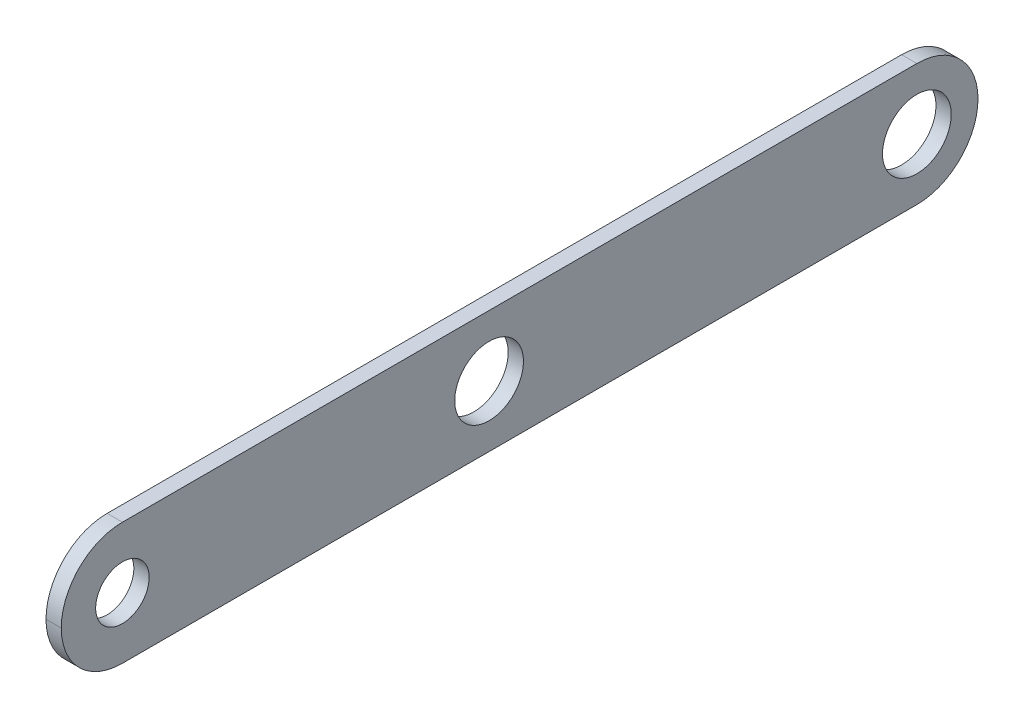
ISO-10303-21;
HEADER;
FILE_DESCRIPTION(('STEP AP214'),'2;1');
FILE_NAME('part.step','',(''),(''),'','','');
FILE_SCHEMA(('AUTOMOTIVE_DESIGN { 1 0 10303 214 1 1 1 1 }'));
ENDSEC;
DATA;
#1=APPLICATION_CONTEXT('core data for automotive mechanical design processes');
#2=APPLICATION_PROTOCOL_DEFINITION('international standard','automotive_design',2000,#1);
#3=PRODUCT_CONTEXT('',#1,'mechanical');
#4=PRODUCT('Part','Part','',(#3));
#5=PRODUCT_RELATED_PRODUCT_CATEGORY('part','',(#4));
#6=PRODUCT_DEFINITION_FORMATION('','',#4);
#7=PRODUCT_DEFINITION_CONTEXT('part definition',#1,'design');
#8=PRODUCT_DEFINITION('design','',#6,#7);
#9=PRODUCT_DEFINITION_SHAPE('','',#8);
#10=(LENGTH_UNIT() NAMED_UNIT(*) SI_UNIT(.MILLI.,.METRE.));
#11=(NAMED_UNIT(*) PLANE_ANGLE_UNIT() SI_UNIT($,.RADIAN.));
#12=(NAMED_UNIT(*) SI_UNIT($,.STERADIAN.) SOLID_ANGLE_UNIT());
#13=UNCERTAINTY_MEASURE_WITH_UNIT(LENGTH_MEASURE(1.E-05),#10,'distance_accuracy_value','');
#14=(GEOMETRIC_REPRESENTATION_CONTEXT(3) GLOBAL_UNCERTAINTY_ASSIGNED_CONTEXT((#13)) GLOBAL_UNIT_ASSIGNED_CONTEXT((#10,
#11,#12)) REPRESENTATION_CONTEXT('',''));
#15=CARTESIAN_POINT('',(0.,0.,0.));
#16=DIRECTION('',(0.,0.,1.));
#17=DIRECTION('',(1.,0.,0.));
#18=AXIS2_PLACEMENT_3D('',#15,#16,#17);
#19=CARTESIAN_POINT('',(6.35,0.,0.));
#20=DIRECTION('',(-1.,0.,0.));
#21=DIRECTION('',(0.,0.,1.));
#22=AXIS2_PLACEMENT_3D('',#19,#20,#21);
#23=PLANE('',#22);
#24=CARTESIAN_POINT('',(6.35,25.4,-25.4));
#25=DIRECTION('',(-1.,0.,0.));
#26=DIRECTION('',(0.,0.,1.));
#27=AXIS2_PLACEMENT_3D('',#24,#25,#26);
#28=CIRCLE('',#27,25.4);
#29=CARTESIAN_POINT('',(6.35,50.8,-25.4));
#30=VERTEX_POINT('',#29);
#31=CARTESIAN_POINT('',(6.35,25.4,0.));
#32=VERTEX_POINT('',#31);
#33=EDGE_CURVE('E151',#30,#32,#28,.F.);
#34=ORIENTED_EDGE('',*,*,#33,.T.);
#35=CARTESIAN_POINT('',(6.35,25.4,-25.4));
#36=DIRECTION('',(-1.,0.,0.));
#37=DIRECTION('',(0.,0.,1.));
#38=AXIS2_PLACEMENT_3D('',#35,#36,#37);
#39=CIRCLE('',#38,25.4);
#40=CARTESIAN_POINT('',(6.35,0.,-25.4));
#41=VERTEX_POINT('',#40);
#42=EDGE_CURVE('E154',#32,#41,#39,.F.);
#43=ORIENTED_EDGE('',*,*,#42,.T.);
#44=DIRECTION('',(0.,0.,-1.));
#45=VECTOR('',#44,1.);
#46=CARTESIAN_POINT('',(6.35,0.,0.));
#47=LINE('',#46,#45);
#48=CARTESIAN_POINT('',(6.35,0.,-355.6));
#49=VERTEX_POINT('',#48);
#50=EDGE_CURVE('E115',#41,#49,#47,.T.);
#51=ORIENTED_EDGE('',*,*,#50,.T.);
#52=CARTESIAN_POINT('',(6.35,25.4,-355.6));
#53=DIRECTION('',(-1.,0.,0.));
#54=DIRECTION('',(0.,0.,1.));
#55=AXIS2_PLACEMENT_3D('',#52,#53,#54);
#56=CIRCLE('',#55,25.4);
#57=CARTESIAN_POINT('',(6.35,25.4,-381.));
#58=VERTEX_POINT('',#57);
#59=EDGE_CURVE('E148',#49,#58,#56,.F.);
#60=ORIENTED_EDGE('',*,*,#59,.T.);
#61=CARTESIAN_POINT('',(6.35,25.4,-355.6));
#62=DIRECTION('',(-1.,0.,0.));
#63=DIRECTION('',(0.,0.,1.));
#64=AXIS2_PLACEMENT_3D('',#61,#62,#63);
#65=CIRCLE('',#64,25.4);
#66=CARTESIAN_POINT('',(6.35,50.8,-355.6));
#67=VERTEX_POINT('',#66);
#68=EDGE_CURVE('E62',#58,#67,#65,.F.);
#69=ORIENTED_EDGE('',*,*,#68,.T.);
#70=DIRECTION('',(0.,0.,1.));
#71=VECTOR('',#70,1.);
#72=CARTESIAN_POINT('',(6.35,50.8,0.));
#73=LINE('',#72,#71);
#74=EDGE_CURVE('E135',#67,#30,#73,.T.);
#75=ORIENTED_EDGE('',*,*,#74,.T.);
#76=EDGE_LOOP('',(#34,#43,#51,#60,#69,#75));
#77=FACE_BOUND('',#76,.T.);
#78=CARTESIAN_POINT('',(6.35,25.4,-25.4));
#79=DIRECTION('',(1.,0.,0.));
#80=DIRECTION('',(0.,0.,-1.));
#81=AXIS2_PLACEMENT_3D('',#78,#79,#80);
#82=CIRCLE('',#81,11.1125);
#83=CARTESIAN_POINT('',(6.35,25.4,-36.5125));
#84=VERTEX_POINT('',#83);
#85=EDGE_CURVE('E126',#84,#84,#82,.T.);
#86=ORIENTED_EDGE('',*,*,#85,.F.);
#87=EDGE_LOOP('',(#86));
#88=FACE_BOUND('',#87,.T.);
#89=CARTESIAN_POINT('',(6.35,25.4,-177.8));
#90=DIRECTION('',(1.,0.,0.));
#91=DIRECTION('',(0.,0.,-1.));
#92=AXIS2_PLACEMENT_3D('',#89,#90,#91);
#93=CIRCLE('',#92,14.2875);
#94=CARTESIAN_POINT('',(6.35,25.4,-192.0875));
#95=VERTEX_POINT('',#94);
#96=EDGE_CURVE('E183',#95,#95,#93,.T.);
#97=ORIENTED_EDGE('',*,*,#96,.F.);
#98=EDGE_LOOP('',(#97));
#99=FACE_BOUND('',#98,.T.);
#100=CARTESIAN_POINT('',(6.35,25.4,-355.6));
#101=DIRECTION('',(1.,0.,0.));
#102=DIRECTION('',(0.,0.,1.));
#103=AXIS2_PLACEMENT_3D('',#100,#101,#102);
#104=CIRCLE('',#103,14.2875);
#105=CARTESIAN_POINT('',(6.35,25.4,-341.3125));
#106=VERTEX_POINT('',#105);
#107=EDGE_CURVE('E163',#106,#106,#104,.T.);
#108=ORIENTED_EDGE('',*,*,#107,.F.);
#109=EDGE_LOOP('',(#108));
#110=FACE_BOUND('',#109,.T.);
#111=ADVANCED_FACE('F39',(#77,#88,#99,#110),#23,.F.);
#112=CARTESIAN_POINT('',(0.,0.,0.));
#113=DIRECTION('',(-1.,0.,0.));
#114=DIRECTION('',(0.,0.,1.));
#115=AXIS2_PLACEMENT_3D('',#112,#113,#114);
#116=PLANE('',#115);
#117=CARTESIAN_POINT('',(0.,25.4,-177.8));
#118=DIRECTION('',(1.,0.,0.));
#119=DIRECTION('',(0.,0.,-1.));
#120=AXIS2_PLACEMENT_3D('',#117,#118,#119);
#121=CIRCLE('',#120,14.2875);
#122=CARTESIAN_POINT('',(0.,25.4,-192.0875));
#123=VERTEX_POINT('',#122);
#124=EDGE_CURVE('E185',#123,#123,#121,.T.);
#125=ORIENTED_EDGE('',*,*,#124,.T.);
#126=EDGE_LOOP('',(#125));
#127=FACE_BOUND('',#126,.T.);
#128=DIRECTION('',(0.,0.,-1.));
#129=VECTOR('',#128,1.);
#130=CARTESIAN_POINT('',(0.,0.,0.));
#131=LINE('',#130,#129);
#132=CARTESIAN_POINT('',(0.,0.,-25.4));
#133=VERTEX_POINT('',#132);
#134=CARTESIAN_POINT('',(0.,0.,-355.6));
#135=VERTEX_POINT('',#134);
#136=EDGE_CURVE('E112',#133,#135,#131,.T.);
#137=ORIENTED_EDGE('',*,*,#136,.F.);
#138=CARTESIAN_POINT('',(0.,25.4,-25.4));
#139=DIRECTION('',(-1.,0.,0.));
#140=DIRECTION('',(0.,0.,1.));
#141=AXIS2_PLACEMENT_3D('',#138,#139,#140);
#142=CIRCLE('',#141,25.4);
#143=CARTESIAN_POINT('',(0.,25.4,0.));
#144=VERTEX_POINT('',#143);
#145=EDGE_CURVE('E94',#133,#144,#142,.T.);
#146=ORIENTED_EDGE('',*,*,#145,.T.);
#147=CARTESIAN_POINT('',(0.,25.4,-25.4));
#148=DIRECTION('',(-1.,0.,0.));
#149=DIRECTION('',(0.,0.,1.));
#150=AXIS2_PLACEMENT_3D('',#147,#148,#149);
#151=CIRCLE('',#150,25.4);
#152=CARTESIAN_POINT('',(0.,50.8,-25.4));
#153=VERTEX_POINT('',#152);
#154=EDGE_CURVE('E105',#144,#153,#151,.T.);
#155=ORIENTED_EDGE('',*,*,#154,.T.);
#156=DIRECTION('',(0.,0.,1.));
#157=VECTOR('',#156,1.);
#158=CARTESIAN_POINT('',(0.,50.8,0.));
#159=LINE('',#158,#157);
#160=CARTESIAN_POINT('',(0.,50.8,-355.6));
#161=VERTEX_POINT('',#160);
#162=EDGE_CURVE('E125',#161,#153,#159,.T.);
#163=ORIENTED_EDGE('',*,*,#162,.F.);
#164=CARTESIAN_POINT('',(0.,25.4,-355.6));
#165=DIRECTION('',(-1.,0.,0.));
#166=DIRECTION('',(0.,0.,1.));
#167=AXIS2_PLACEMENT_3D('',#164,#165,#166);
#168=CIRCLE('',#167,25.4);
#169=CARTESIAN_POINT('',(0.,25.4,-381.));
#170=VERTEX_POINT('',#169);
#171=EDGE_CURVE('E117',#161,#170,#168,.T.);
#172=ORIENTED_EDGE('',*,*,#171,.T.);
#173=CARTESIAN_POINT('',(0.,25.4,-355.6));
#174=DIRECTION('',(-1.,0.,0.));
#175=DIRECTION('',(0.,0.,1.));
#176=AXIS2_PLACEMENT_3D('',#173,#174,#175);
#177=CIRCLE('',#176,25.4);
#178=EDGE_CURVE('E123',#170,#135,#177,.T.);
#179=ORIENTED_EDGE('',*,*,#178,.T.);
#180=EDGE_LOOP('',(#137,#146,#155,#163,#172,#179));
#181=FACE_BOUND('',#180,.T.);
#182=CARTESIAN_POINT('',(0.,25.4,-25.4));
#183=DIRECTION('',(1.,0.,0.));
#184=DIRECTION('',(0.,0.,-1.));
#185=AXIS2_PLACEMENT_3D('',#182,#183,#184);
#186=CIRCLE('',#185,11.1125);
#187=CARTESIAN_POINT('',(0.,25.4,-36.5125));
#188=VERTEX_POINT('',#187);
#189=EDGE_CURVE('E132',#188,#188,#186,.T.);
#190=ORIENTED_EDGE('',*,*,#189,.T.);
#191=EDGE_LOOP('',(#190));
#192=FACE_BOUND('',#191,.T.);
#193=CARTESIAN_POINT('',(0.,25.4,-355.6));
#194=DIRECTION('',(1.,0.,0.));
#195=DIRECTION('',(0.,0.,1.));
#196=AXIS2_PLACEMENT_3D('',#193,#194,#195);
#197=CIRCLE('',#196,14.2875);
#198=CARTESIAN_POINT('',(0.,25.4,-341.3125));
#199=VERTEX_POINT('',#198);
#200=EDGE_CURVE('E159',#199,#199,#197,.T.);
#201=ORIENTED_EDGE('',*,*,#200,.T.);
#202=EDGE_LOOP('',(#201));
#203=FACE_BOUND('',#202,.T.);
#204=ADVANCED_FACE('F120',(#127,#181,#192,#203),#116,.T.);
#205=CARTESIAN_POINT('',(6.35,0.,0.));
#206=DIRECTION('',(0.,1.,0.));
#207=DIRECTION('',(0.,0.,1.));
#208=AXIS2_PLACEMENT_3D('',#205,#206,#207);
#209=PLANE('',#208);
#210=ORIENTED_EDGE('',*,*,#50,.F.);
#211=DIRECTION('',(-1.,0.,0.));
#212=VECTOR('',#211,1.);
#213=CARTESIAN_POINT('',(6.35,0.,-25.4));
#214=LINE('',#213,#212);
#215=EDGE_CURVE('E98',#41,#133,#214,.T.);
#216=ORIENTED_EDGE('',*,*,#215,.T.);
#217=ORIENTED_EDGE('',*,*,#136,.T.);
#218=DIRECTION('',(-1.,0.,0.));
#219=VECTOR('',#218,1.);
#220=CARTESIAN_POINT('',(6.35,0.,-355.6));
#221=LINE('',#220,#219);
#222=EDGE_CURVE('E118',#135,#49,#221,.F.);
#223=ORIENTED_EDGE('',*,*,#222,.T.);
#224=EDGE_LOOP('',(#210,#216,#217,#223));
#225=FACE_BOUND('',#224,.T.);
#226=ADVANCED_FACE('F110',(#225),#209,.F.);
#227=CARTESIAN_POINT('',(6.35,50.8,0.));
#228=DIRECTION('',(0.,-1.,0.));
#229=DIRECTION('',(0.,0.,-1.));
#230=AXIS2_PLACEMENT_3D('',#227,#228,#229);
#231=PLANE('',#230);
#232=ORIENTED_EDGE('',*,*,#162,.T.);
#233=DIRECTION('',(-1.,0.,0.));
#234=VECTOR('',#233,1.);
#235=CARTESIAN_POINT('',(6.35,50.8,-25.4));
#236=LINE('',#235,#234);
#237=EDGE_CURVE('E11',#153,#30,#236,.F.);
#238=ORIENTED_EDGE('',*,*,#237,.T.);
#239=ORIENTED_EDGE('',*,*,#74,.F.);
#240=DIRECTION('',(-1.,0.,0.));
#241=VECTOR('',#240,1.);
#242=CARTESIAN_POINT('',(6.35,50.8,-355.6));
#243=LINE('',#242,#241);
#244=EDGE_CURVE('E49',#67,#161,#243,.T.);
#245=ORIENTED_EDGE('',*,*,#244,.T.);
#246=EDGE_LOOP('',(#232,#238,#239,#245));
#247=FACE_BOUND('',#246,.T.);
#248=ADVANCED_FACE('F173',(#247),#231,.F.);
#249=CARTESIAN_POINT('',(6.35,25.4,-25.4));
#250=DIRECTION('',(-1.,0.,0.));
#251=DIRECTION('',(0.,0.,1.));
#252=AXIS2_PLACEMENT_3D('',#249,#250,#251);
#253=CYLINDRICAL_SURFACE('',#252,11.1125);
#254=ORIENTED_EDGE('',*,*,#85,.T.);
#255=EDGE_LOOP('',(#254));
#256=FACE_BOUND('',#255,.T.);
#257=ORIENTED_EDGE('',*,*,#189,.F.);
#258=EDGE_LOOP('',(#257));
#259=FACE_BOUND('',#258,.T.);
#260=ADVANCED_FACE('F207',(#256,#259),#253,.F.);
#261=CARTESIAN_POINT('',(6.35,25.4,-177.8));
#262=DIRECTION('',(-1.,0.,0.));
#263=DIRECTION('',(0.,0.,1.));
#264=AXIS2_PLACEMENT_3D('',#261,#262,#263);
#265=CYLINDRICAL_SURFACE('',#264,14.2875);
#266=ORIENTED_EDGE('',*,*,#96,.T.);
#267=EDGE_LOOP('',(#266));
#268=FACE_BOUND('',#267,.T.);
#269=ORIENTED_EDGE('',*,*,#124,.F.);
#270=EDGE_LOOP('',(#269));
#271=FACE_BOUND('',#270,.T.);
#272=ADVANCED_FACE('F238',(#268,#271),#265,.F.);
#273=CARTESIAN_POINT('',(6.35,25.4,-355.6));
#274=DIRECTION('',(-1.,0.,0.));
#275=DIRECTION('',(0.,0.,1.));
#276=AXIS2_PLACEMENT_3D('',#273,#274,#275);
#277=CYLINDRICAL_SURFACE('',#276,14.2875);
#278=ORIENTED_EDGE('',*,*,#107,.T.);
#279=EDGE_LOOP('',(#278));
#280=FACE_BOUND('',#279,.T.);
#281=ORIENTED_EDGE('',*,*,#200,.F.);
#282=EDGE_LOOP('',(#281));
#283=FACE_BOUND('',#282,.T.);
#284=ADVANCED_FACE('F196',(#280,#283),#277,.F.);
#285=CARTESIAN_POINT('',(6.35,25.4,-25.4));
#286=DIRECTION('',(-1.,0.,0.));
#287=DIRECTION('',(0.,0.,1.));
#288=AXIS2_PLACEMENT_3D('',#285,#286,#287);
#289=CYLINDRICAL_SURFACE('',#288,25.4);
#290=DIRECTION('',(-1.,0.,0.));
#291=VECTOR('',#290,1.);
#292=CARTESIAN_POINT('',(6.35,25.4,0.));
#293=LINE('',#292,#291);
#294=EDGE_CURVE('E100',#32,#144,#293,.T.);
#295=ORIENTED_EDGE('',*,*,#294,.F.);
#296=ORIENTED_EDGE('',*,*,#33,.F.);
#297=ORIENTED_EDGE('',*,*,#237,.F.);
#298=ORIENTED_EDGE('',*,*,#154,.F.);
#299=EDGE_LOOP('',(#295,#296,#297,#298));
#300=FACE_BOUND('',#299,.T.);
#301=ADVANCED_FACE('F175',(#300),#289,.T.);
#302=CARTESIAN_POINT('',(6.35,25.4,-25.4));
#303=DIRECTION('',(-1.,0.,0.));
#304=DIRECTION('',(0.,0.,1.));
#305=AXIS2_PLACEMENT_3D('',#302,#303,#304);
#306=CYLINDRICAL_SURFACE('',#305,25.4);
#307=ORIENTED_EDGE('',*,*,#42,.F.);
#308=ORIENTED_EDGE('',*,*,#294,.T.);
#309=ORIENTED_EDGE('',*,*,#145,.F.);
#310=ORIENTED_EDGE('',*,*,#215,.F.);
#311=EDGE_LOOP('',(#307,#308,#309,#310));
#312=FACE_BOUND('',#311,.T.);
#313=ADVANCED_FACE('F97',(#312),#306,.T.);
#314=CARTESIAN_POINT('',(6.35,25.4,-355.6));
#315=DIRECTION('',(-1.,0.,0.));
#316=DIRECTION('',(0.,0.,1.));
#317=AXIS2_PLACEMENT_3D('',#314,#315,#316);
#318=CYLINDRICAL_SURFACE('',#317,25.4);
#319=ORIENTED_EDGE('',*,*,#244,.F.);
#320=ORIENTED_EDGE('',*,*,#68,.F.);
#321=DIRECTION('',(-1.,0.,0.));
#322=VECTOR('',#321,1.);
#323=CARTESIAN_POINT('',(6.35,25.4,-381.));
#324=LINE('',#323,#322);
#325=EDGE_CURVE('E43',#170,#58,#324,.F.);
#326=ORIENTED_EDGE('',*,*,#325,.F.);
#327=ORIENTED_EDGE('',*,*,#171,.F.);
#328=EDGE_LOOP('',(#319,#320,#326,#327));
#329=FACE_BOUND('',#328,.T.);
#330=ADVANCED_FACE('F41',(#329),#318,.T.);
#331=CARTESIAN_POINT('',(6.35,25.4,-355.6));
#332=DIRECTION('',(-1.,0.,0.));
#333=DIRECTION('',(0.,0.,1.));
#334=AXIS2_PLACEMENT_3D('',#331,#332,#333);
#335=CYLINDRICAL_SURFACE('',#334,25.4);
#336=ORIENTED_EDGE('',*,*,#59,.F.);
#337=ORIENTED_EDGE('',*,*,#222,.F.);
#338=ORIENTED_EDGE('',*,*,#178,.F.);
#339=ORIENTED_EDGE('',*,*,#325,.T.);
#340=EDGE_LOOP('',(#336,#337,#338,#339));
#341=FACE_BOUND('',#340,.T.);
#342=ADVANCED_FACE('F168',(#341),#335,.T.);
#343=CLOSED_SHELL('',(#111,#204,#226,#248,#260,#272,#284,#301,#313,#330,#342));
#344=MANIFOLD_SOLID_BREP('B2',#343);
#345=ADVANCED_BREP_SHAPE_REPRESENTATION('',(#18,#344),#14);
#346=SHAPE_DEFINITION_REPRESENTATION(#9,#345);
ENDSEC;
END-ISO-10303-21;
